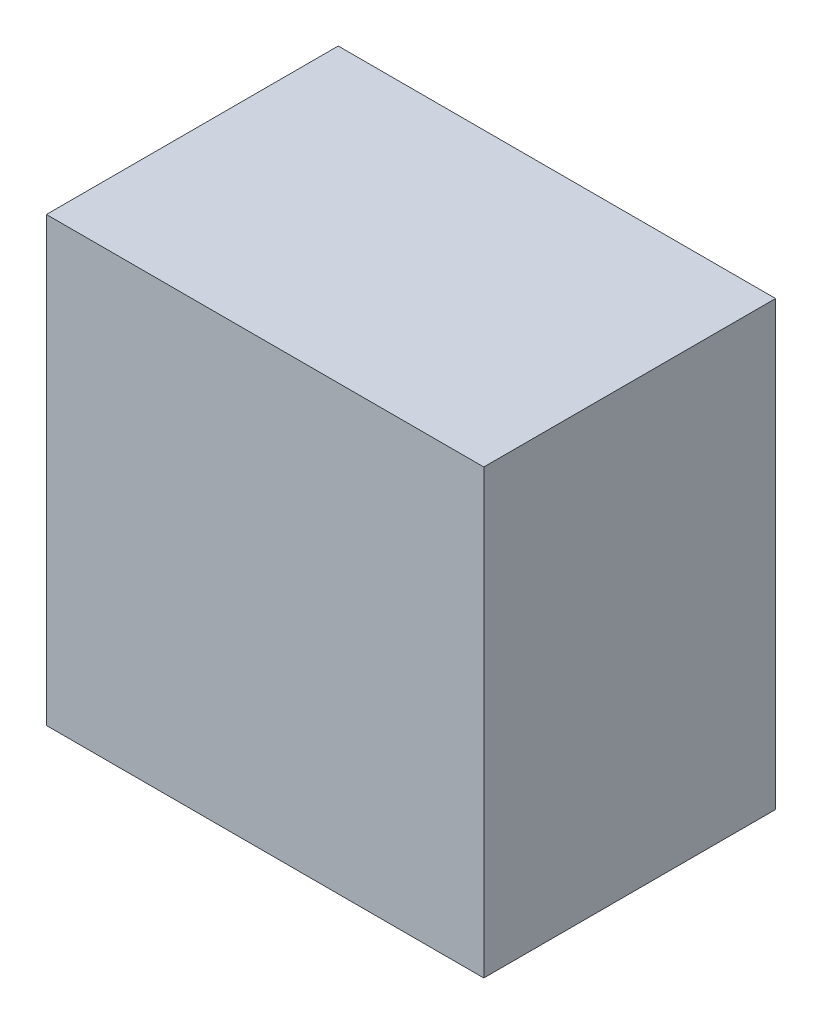
ISO-10303-21;
HEADER;
FILE_DESCRIPTION(('STEP AP214'),'2;1');
FILE_NAME('part.step','',(''),(''),'','','');
FILE_SCHEMA(('AUTOMOTIVE_DESIGN { 1 0 10303 214 1 1 1 1 }'));
ENDSEC;
DATA;
#1=APPLICATION_CONTEXT('core data for automotive mechanical design processes');
#2=APPLICATION_PROTOCOL_DEFINITION('international standard','automotive_design',2000,#1);
#3=PRODUCT_CONTEXT('',#1,'mechanical');
#4=PRODUCT('Part','Part','',(#3));
#5=PRODUCT_RELATED_PRODUCT_CATEGORY('part','',(#4));
#6=PRODUCT_DEFINITION_FORMATION('','',#4);
#7=PRODUCT_DEFINITION_CONTEXT('part definition',#1,'design');
#8=PRODUCT_DEFINITION('design','',#6,#7);
#9=PRODUCT_DEFINITION_SHAPE('','',#8);
#10=(LENGTH_UNIT() NAMED_UNIT(*) SI_UNIT(.MILLI.,.METRE.));
#11=(NAMED_UNIT(*) PLANE_ANGLE_UNIT() SI_UNIT($,.RADIAN.));
#12=(NAMED_UNIT(*) SI_UNIT($,.STERADIAN.) SOLID_ANGLE_UNIT());
#13=UNCERTAINTY_MEASURE_WITH_UNIT(LENGTH_MEASURE(1.E-05),#10,'distance_accuracy_value','');
#14=(GEOMETRIC_REPRESENTATION_CONTEXT(3) GLOBAL_UNCERTAINTY_ASSIGNED_CONTEXT((#13)) GLOBAL_UNIT_ASSIGNED_CONTEXT((#10,
#11,#12)) REPRESENTATION_CONTEXT('',''));
#15=CARTESIAN_POINT('',(0.,0.,0.));
#16=DIRECTION('',(0.,0.,1.));
#17=DIRECTION('',(1.,0.,0.));
#18=AXIS2_PLACEMENT_3D('',#15,#16,#17);
#19=CARTESIAN_POINT('',(-45.5930642340263,23.5799416891496,50.));
#20=DIRECTION('',(1.,0.,0.));
#21=DIRECTION('',(0.,0.,-1.));
#22=AXIS2_PLACEMENT_3D('',#19,#20,#21);
#23=PLANE('',#22);
#24=DIRECTION('',(0.,-1.,0.));
#25=VECTOR('',#24,1.);
#26=CARTESIAN_POINT('',(-45.5930642340263,23.5799416891496,0.));
#27=LINE('',#26,#25);
#28=CARTESIAN_POINT('',(-45.5930642340263,23.5799416891496,0.));
#29=VERTEX_POINT('',#28);
#30=CARTESIAN_POINT('',(-45.5930642340263,-52.2511356003292,0.));
#31=VERTEX_POINT('',#30);
#32=EDGE_CURVE('E101',#29,#31,#27,.T.);
#33=ORIENTED_EDGE('',*,*,#32,.T.);
#34=DIRECTION('',(0.,0.,-1.));
#35=VECTOR('',#34,1.);
#36=CARTESIAN_POINT('',(-45.5930642340263,-52.2511356003292,50.));
#37=LINE('',#36,#35);
#38=CARTESIAN_POINT('',(-45.5930642340263,-52.2511356003292,50.));
#39=VERTEX_POINT('',#38);
#40=EDGE_CURVE('E11',#39,#31,#37,.T.);
#41=ORIENTED_EDGE('',*,*,#40,.F.);
#42=DIRECTION('',(0.,-1.,0.));
#43=VECTOR('',#42,1.);
#44=CARTESIAN_POINT('',(-45.5930642340263,23.5799416891496,50.));
#45=LINE('',#44,#43);
#46=CARTESIAN_POINT('',(-45.5930642340263,23.5799416891496,50.));
#47=VERTEX_POINT('',#46);
#48=EDGE_CURVE('E89',#47,#39,#45,.T.);
#49=ORIENTED_EDGE('',*,*,#48,.F.);
#50=DIRECTION('',(0.,0.,-1.));
#51=VECTOR('',#50,1.);
#52=CARTESIAN_POINT('',(-45.5930642340263,23.5799416891496,50.));
#53=LINE('',#52,#51);
#54=EDGE_CURVE('E97',#47,#29,#53,.T.);
#55=ORIENTED_EDGE('',*,*,#54,.T.);
#56=EDGE_LOOP('',(#33,#41,#49,#55));
#57=FACE_BOUND('',#56,.T.);
#58=ADVANCED_FACE('F38',(#57),#23,.F.);
#59=CARTESIAN_POINT('',(-45.5930642340263,-52.2511356003292,50.));
#60=DIRECTION('',(0.,1.,0.));
#61=DIRECTION('',(0.,0.,1.));
#62=AXIS2_PLACEMENT_3D('',#59,#60,#61);
#63=PLANE('',#62);
#64=DIRECTION('',(1.,0.,0.));
#65=VECTOR('',#64,1.);
#66=CARTESIAN_POINT('',(-45.5930642340263,-52.2511356003292,0.));
#67=LINE('',#66,#65);
#68=CARTESIAN_POINT('',(29.3481085919893,-52.2511356003292,0.));
#69=VERTEX_POINT('',#68);
#70=EDGE_CURVE('E93',#31,#69,#67,.T.);
#71=ORIENTED_EDGE('',*,*,#70,.T.);
#72=DIRECTION('',(0.,0.,-1.));
#73=VECTOR('',#72,1.);
#74=CARTESIAN_POINT('',(29.3481085919893,-52.2511356003292,50.));
#75=LINE('',#74,#73);
#76=CARTESIAN_POINT('',(29.3481085919893,-52.2511356003292,50.));
#77=VERTEX_POINT('',#76);
#78=EDGE_CURVE('E46',#77,#69,#75,.T.);
#79=ORIENTED_EDGE('',*,*,#78,.F.);
#80=DIRECTION('',(1.,0.,0.));
#81=VECTOR('',#80,1.);
#82=CARTESIAN_POINT('',(-45.5930642340263,-52.2511356003292,50.));
#83=LINE('',#82,#81);
#84=EDGE_CURVE('E84',#39,#77,#83,.T.);
#85=ORIENTED_EDGE('',*,*,#84,.F.);
#86=ORIENTED_EDGE('',*,*,#40,.T.);
#87=EDGE_LOOP('',(#71,#79,#85,#86));
#88=FACE_BOUND('',#87,.T.);
#89=ADVANCED_FACE('F92',(#88),#63,.F.);
#90=CARTESIAN_POINT('',(29.3481085919893,23.5799416891496,50.));
#91=DIRECTION('',(-1.,0.,0.));
#92=DIRECTION('',(0.,0.,1.));
#93=AXIS2_PLACEMENT_3D('',#90,#91,#92);
#94=PLANE('',#93);
#95=DIRECTION('',(0.,1.,0.));
#96=VECTOR('',#95,1.);
#97=CARTESIAN_POINT('',(29.3481085919893,23.5799416891496,0.));
#98=LINE('',#97,#96);
#99=CARTESIAN_POINT('',(29.3481085919893,23.5799416891496,0.));
#100=VERTEX_POINT('',#99);
#101=EDGE_CURVE('E71',#69,#100,#98,.T.);
#102=ORIENTED_EDGE('',*,*,#101,.T.);
#103=DIRECTION('',(0.,0.,-1.));
#104=VECTOR('',#103,1.);
#105=CARTESIAN_POINT('',(29.3481085919893,23.5799416891496,50.));
#106=LINE('',#105,#104);
#107=CARTESIAN_POINT('',(29.3481085919893,23.5799416891496,50.));
#108=VERTEX_POINT('',#107);
#109=EDGE_CURVE('E94',#108,#100,#106,.T.);
#110=ORIENTED_EDGE('',*,*,#109,.F.);
#111=DIRECTION('',(0.,1.,0.));
#112=VECTOR('',#111,1.);
#113=CARTESIAN_POINT('',(29.3481085919893,23.5799416891496,50.));
#114=LINE('',#113,#112);
#115=EDGE_CURVE('E87',#77,#108,#114,.T.);
#116=ORIENTED_EDGE('',*,*,#115,.F.);
#117=ORIENTED_EDGE('',*,*,#78,.T.);
#118=EDGE_LOOP('',(#102,#110,#116,#117));
#119=FACE_BOUND('',#118,.T.);
#120=ADVANCED_FACE('F95',(#119),#94,.F.);
#121=CARTESIAN_POINT('',(-45.5930642340263,23.5799416891496,50.));
#122=DIRECTION('',(0.,-1.,0.));
#123=DIRECTION('',(0.,0.,-1.));
#124=AXIS2_PLACEMENT_3D('',#121,#122,#123);
#125=PLANE('',#124);
#126=DIRECTION('',(-1.,0.,0.));
#127=VECTOR('',#126,1.);
#128=CARTESIAN_POINT('',(-45.5930642340263,23.5799416891496,0.));
#129=LINE('',#128,#127);
#130=EDGE_CURVE('E77',#100,#29,#129,.T.);
#131=ORIENTED_EDGE('',*,*,#130,.T.);
#132=ORIENTED_EDGE('',*,*,#54,.F.);
#133=DIRECTION('',(-1.,0.,0.));
#134=VECTOR('',#133,1.);
#135=CARTESIAN_POINT('',(-45.5930642340263,23.5799416891496,50.));
#136=LINE('',#135,#134);
#137=EDGE_CURVE('E54',#108,#47,#136,.T.);
#138=ORIENTED_EDGE('',*,*,#137,.F.);
#139=ORIENTED_EDGE('',*,*,#109,.T.);
#140=EDGE_LOOP('',(#131,#132,#138,#139));
#141=FACE_BOUND('',#140,.T.);
#142=ADVANCED_FACE('F108',(#141),#125,.F.);
#143=CARTESIAN_POINT('',(-45.5930642340263,-52.2511356003292,50.));
#144=DIRECTION('',(0.,0.,1.));
#145=DIRECTION('',(1.,0.,0.));
#146=AXIS2_PLACEMENT_3D('',#143,#144,#145);
#147=PLANE('',#146);
#148=ORIENTED_EDGE('',*,*,#48,.T.);
#149=ORIENTED_EDGE('',*,*,#84,.T.);
#150=ORIENTED_EDGE('',*,*,#115,.T.);
#151=ORIENTED_EDGE('',*,*,#137,.T.);
#152=EDGE_LOOP('',(#148,#149,#150,#151));
#153=FACE_BOUND('',#152,.T.);
#154=ADVANCED_FACE('F85',(#153),#147,.T.);
#155=CARTESIAN_POINT('',(-45.5930642340263,-52.2511356003292,0.));
#156=DIRECTION('',(0.,0.,1.));
#157=DIRECTION('',(1.,0.,0.));
#158=AXIS2_PLACEMENT_3D('',#155,#156,#157);
#159=PLANE('',#158);
#160=ORIENTED_EDGE('',*,*,#32,.F.);
#161=ORIENTED_EDGE('',*,*,#130,.F.);
#162=ORIENTED_EDGE('',*,*,#101,.F.);
#163=ORIENTED_EDGE('',*,*,#70,.F.);
#164=EDGE_LOOP('',(#160,#161,#162,#163));
#165=FACE_BOUND('',#164,.T.);
#166=ADVANCED_FACE('F111',(#165),#159,.F.);
#167=CLOSED_SHELL('',(#58,#89,#120,#142,#154,#166));
#168=MANIFOLD_SOLID_BREP('B2',#167);
#169=ADVANCED_BREP_SHAPE_REPRESENTATION('',(#18,#168),#14);
#170=SHAPE_DEFINITION_REPRESENTATION(#9,#169);
ENDSEC;
END-ISO-10303-21;
